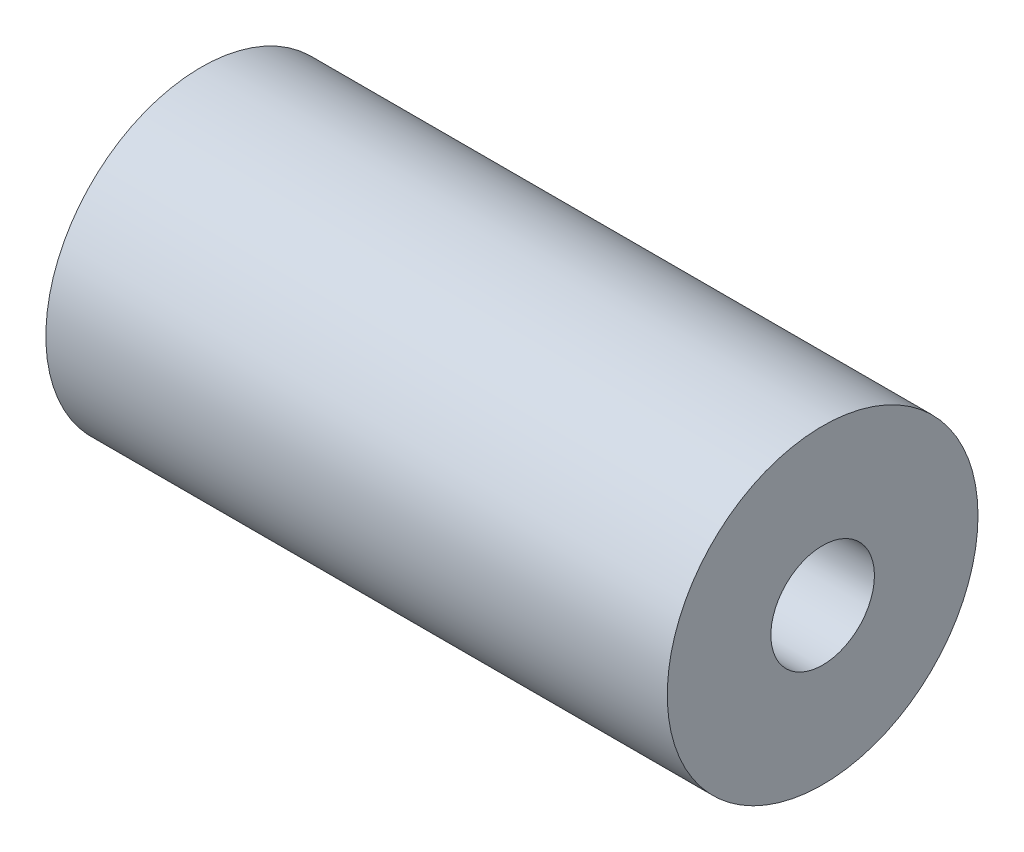
ISO-10303-21;
HEADER;
FILE_DESCRIPTION(('STEP AP214'),'2;1');
FILE_NAME('part.step','',(''),(''),'','','');
FILE_SCHEMA(('AUTOMOTIVE_DESIGN { 1 0 10303 214 1 1 1 1 }'));
ENDSEC;
DATA;
#1=APPLICATION_CONTEXT('core data for automotive mechanical design processes');
#2=APPLICATION_PROTOCOL_DEFINITION('international standard','automotive_design',2000,#1);
#3=PRODUCT_CONTEXT('',#1,'mechanical');
#4=PRODUCT('Part','Part','',(#3));
#5=PRODUCT_RELATED_PRODUCT_CATEGORY('part','',(#4));
#6=PRODUCT_DEFINITION_FORMATION('','',#4);
#7=PRODUCT_DEFINITION_CONTEXT('part definition',#1,'design');
#8=PRODUCT_DEFINITION('design','',#6,#7);
#9=PRODUCT_DEFINITION_SHAPE('','',#8);
#10=(LENGTH_UNIT() NAMED_UNIT(*) SI_UNIT(.MILLI.,.METRE.));
#11=(NAMED_UNIT(*) PLANE_ANGLE_UNIT() SI_UNIT($,.RADIAN.));
#12=(NAMED_UNIT(*) SI_UNIT($,.STERADIAN.) SOLID_ANGLE_UNIT());
#13=UNCERTAINTY_MEASURE_WITH_UNIT(LENGTH_MEASURE(1.E-05),#10,'distance_accuracy_value','');
#14=(GEOMETRIC_REPRESENTATION_CONTEXT(3) GLOBAL_UNCERTAINTY_ASSIGNED_CONTEXT((#13)) GLOBAL_UNIT_ASSIGNED_CONTEXT((#10,
#11,#12)) REPRESENTATION_CONTEXT('',''));
#15=CARTESIAN_POINT('',(0.,0.,0.));
#16=DIRECTION('',(0.,0.,1.));
#17=DIRECTION('',(1.,0.,0.));
#18=AXIS2_PLACEMENT_3D('',#15,#16,#17);
#19=CARTESIAN_POINT('',(120.,0.,0.));
#20=DIRECTION('',(1.,0.,0.));
#21=DIRECTION('',(0.,0.,-1.));
#22=AXIS2_PLACEMENT_3D('',#19,#20,#21);
#23=PLANE('',#22);
#24=CARTESIAN_POINT('',(120.,0.,0.));
#25=DIRECTION('',(1.,0.,0.));
#26=DIRECTION('',(0.,0.,-1.));
#27=AXIS2_PLACEMENT_3D('',#24,#25,#26);
#28=CIRCLE('',#27,30.);
#29=CARTESIAN_POINT('',(120.,0.,-30.));
#30=VERTEX_POINT('',#29);
#31=EDGE_CURVE('E10',#30,#30,#28,.T.);
#32=ORIENTED_EDGE('',*,*,#31,.T.);
#33=EDGE_LOOP('',(#32));
#34=FACE_BOUND('',#33,.T.);
#35=CARTESIAN_POINT('',(120.,0.,0.));
#36=DIRECTION('',(1.,0.,0.));
#37=DIRECTION('',(0.,0.,-1.));
#38=AXIS2_PLACEMENT_3D('',#35,#36,#37);
#39=CIRCLE('',#38,10.);
#40=CARTESIAN_POINT('',(120.,0.,-10.));
#41=VERTEX_POINT('',#40);
#42=EDGE_CURVE('E50',#41,#41,#39,.T.);
#43=ORIENTED_EDGE('',*,*,#42,.F.);
#44=EDGE_LOOP('',(#43));
#45=FACE_BOUND('',#44,.T.);
#46=ADVANCED_FACE('F37',(#34,#45),#23,.T.);
#47=CARTESIAN_POINT('',(0.,0.,0.));
#48=DIRECTION('',(1.,0.,0.));
#49=DIRECTION('',(0.,0.,-1.));
#50=AXIS2_PLACEMENT_3D('',#47,#48,#49);
#51=PLANE('',#50);
#52=CARTESIAN_POINT('',(0.,0.,0.));
#53=DIRECTION('',(1.,0.,0.));
#54=DIRECTION('',(0.,0.,-1.));
#55=AXIS2_PLACEMENT_3D('',#52,#53,#54);
#56=CIRCLE('',#55,30.);
#57=CARTESIAN_POINT('',(0.,0.,-30.));
#58=VERTEX_POINT('',#57);
#59=EDGE_CURVE('E41',#58,#58,#56,.T.);
#60=ORIENTED_EDGE('',*,*,#59,.F.);
#61=EDGE_LOOP('',(#60));
#62=FACE_BOUND('',#61,.T.);
#63=CARTESIAN_POINT('',(0.,0.,0.));
#64=DIRECTION('',(1.,0.,0.));
#65=DIRECTION('',(0.,0.,-1.));
#66=AXIS2_PLACEMENT_3D('',#63,#64,#65);
#67=CIRCLE('',#66,10.);
#68=CARTESIAN_POINT('',(0.,0.,-10.));
#69=VERTEX_POINT('',#68);
#70=EDGE_CURVE('E52',#69,#69,#67,.T.);
#71=ORIENTED_EDGE('',*,*,#70,.T.);
#72=EDGE_LOOP('',(#71));
#73=FACE_BOUND('',#72,.T.);
#74=ADVANCED_FACE('F64',(#62,#73),#51,.F.);
#75=CARTESIAN_POINT('',(120.,0.,0.));
#76=DIRECTION('',(-1.,0.,0.));
#77=DIRECTION('',(0.,0.,1.));
#78=AXIS2_PLACEMENT_3D('',#75,#76,#77);
#79=CYLINDRICAL_SURFACE('',#78,30.);
#80=ORIENTED_EDGE('',*,*,#31,.F.);
#81=EDGE_LOOP('',(#80));
#82=FACE_BOUND('',#81,.T.);
#83=ORIENTED_EDGE('',*,*,#59,.T.);
#84=EDGE_LOOP('',(#83));
#85=FACE_BOUND('',#84,.T.);
#86=ADVANCED_FACE('F39',(#82,#85),#79,.T.);
#87=CARTESIAN_POINT('',(120.,0.,0.));
#88=DIRECTION('',(-1.,0.,0.));
#89=DIRECTION('',(0.,0.,1.));
#90=AXIS2_PLACEMENT_3D('',#87,#88,#89);
#91=CYLINDRICAL_SURFACE('',#90,10.);
#92=ORIENTED_EDGE('',*,*,#42,.T.);
#93=EDGE_LOOP('',(#92));
#94=FACE_BOUND('',#93,.T.);
#95=ORIENTED_EDGE('',*,*,#70,.F.);
#96=EDGE_LOOP('',(#95));
#97=FACE_BOUND('',#96,.T.);
#98=ADVANCED_FACE('F60',(#94,#97),#91,.F.);
#99=CLOSED_SHELL('',(#46,#74,#86,#98));
#100=MANIFOLD_SOLID_BREP('B2',#99);
#101=ADVANCED_BREP_SHAPE_REPRESENTATION('',(#18,#100),#14);
#102=SHAPE_DEFINITION_REPRESENTATION(#9,#101);
ENDSEC;
END-ISO-10303-21;
